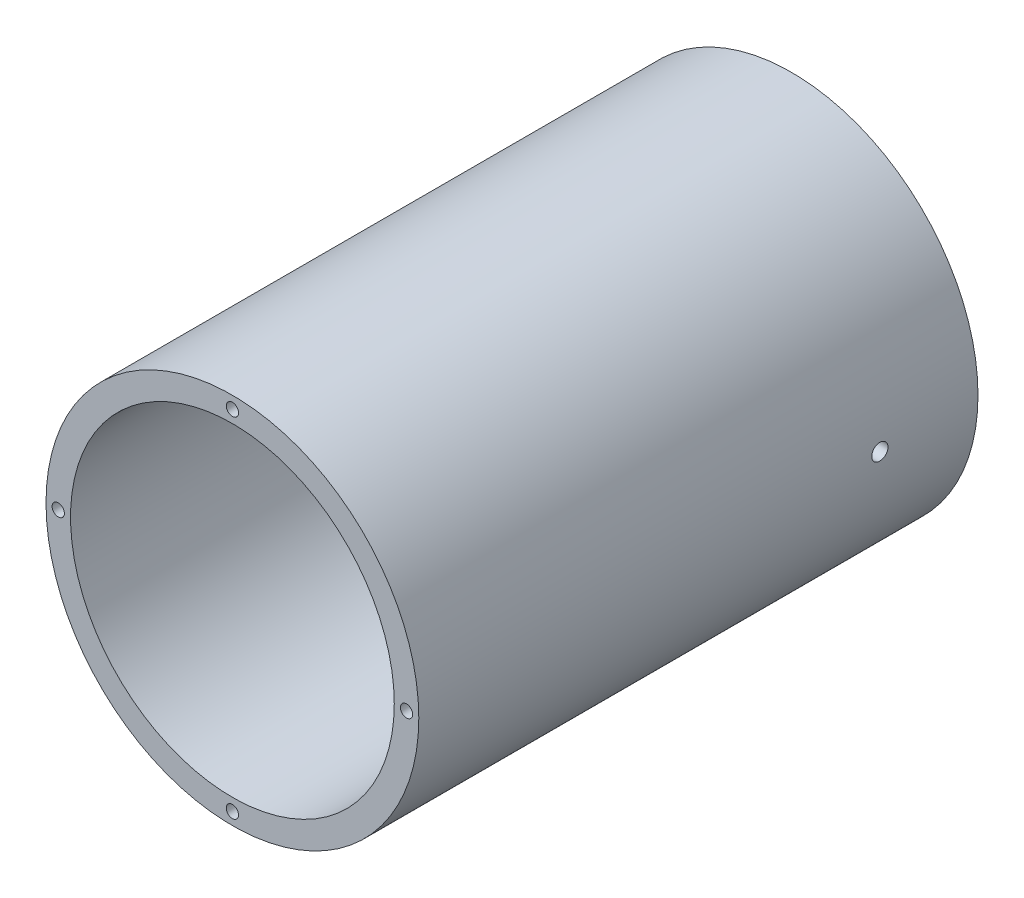
ISO-10303-21;
HEADER;
FILE_DESCRIPTION(('STEP AP214'),'2;1');
FILE_NAME('part.step','',(''),(''),'','','');
FILE_SCHEMA(('AUTOMOTIVE_DESIGN { 1 0 10303 214 1 1 1 1 }'));
ENDSEC;
DATA;
#1=APPLICATION_CONTEXT('core data for automotive mechanical design processes');
#2=APPLICATION_PROTOCOL_DEFINITION('international standard','automotive_design',2000,#1);
#3=PRODUCT_CONTEXT('',#1,'mechanical');
#4=PRODUCT('Part','Part','',(#3));
#5=PRODUCT_RELATED_PRODUCT_CATEGORY('part','',(#4));
#6=PRODUCT_DEFINITION_FORMATION('','',#4);
#7=PRODUCT_DEFINITION_CONTEXT('part definition',#1,'design');
#8=PRODUCT_DEFINITION('design','',#6,#7);
#9=PRODUCT_DEFINITION_SHAPE('','',#8);
#10=(LENGTH_UNIT() NAMED_UNIT(*) SI_UNIT(.MILLI.,.METRE.));
#11=(NAMED_UNIT(*) PLANE_ANGLE_UNIT() SI_UNIT($,.RADIAN.));
#12=(NAMED_UNIT(*) SI_UNIT($,.STERADIAN.) SOLID_ANGLE_UNIT());
#13=UNCERTAINTY_MEASURE_WITH_UNIT(LENGTH_MEASURE(1.E-05),#10,'distance_accuracy_value','');
#14=(GEOMETRIC_REPRESENTATION_CONTEXT(3) GLOBAL_UNCERTAINTY_ASSIGNED_CONTEXT((#13)) GLOBAL_UNIT_ASSIGNED_CONTEXT((#10,
#11,#12)) REPRESENTATION_CONTEXT('',''));
#15=CARTESIAN_POINT('',(0.,0.,0.));
#16=DIRECTION('',(0.,0.,1.));
#17=DIRECTION('',(1.,0.,0.));
#18=AXIS2_PLACEMENT_3D('',#15,#16,#17);
#19=CARTESIAN_POINT('',(0.,0.,57.));
#20=DIRECTION('',(0.,0.,1.));
#21=DIRECTION('',(1.,0.,0.));
#22=AXIS2_PLACEMENT_3D('',#19,#20,#21);
#23=PLANE('',#22);
#24=CARTESIAN_POINT('',(0.,35.5,57.));
#25=DIRECTION('',(0.,0.,1.));
#26=DIRECTION('',(1.,0.,0.));
#27=AXIS2_PLACEMENT_3D('',#24,#25,#26);
#28=CIRCLE('',#27,1.24999999999999);
#29=CARTESIAN_POINT('',(1.24999999999999,35.5,57.));
#30=VERTEX_POINT('',#29);
#31=EDGE_CURVE('E141',#30,#30,#28,.T.);
#32=ORIENTED_EDGE('',*,*,#31,.F.);
#33=EDGE_LOOP('',(#32));
#34=FACE_BOUND('',#33,.T.);
#35=CARTESIAN_POINT('',(35.500000000002,1.95693415158078E-12,57.));
#36=DIRECTION('',(0.,0.,1.));
#37=DIRECTION('',(1.,0.,0.));
#38=AXIS2_PLACEMENT_3D('',#35,#36,#37);
#39=CIRCLE('',#38,1.24999999999999);
#40=CARTESIAN_POINT('',(36.7500000000019,1.95693415158078E-12,57.));
#41=VERTEX_POINT('',#40);
#42=EDGE_CURVE('E149',#41,#41,#39,.T.);
#43=ORIENTED_EDGE('',*,*,#42,.F.);
#44=EDGE_LOOP('',(#43));
#45=FACE_BOUND('',#44,.T.);
#46=CARTESIAN_POINT('',(3.91386830316155E-12,-35.5,57.));
#47=DIRECTION('',(0.,0.,1.));
#48=DIRECTION('',(1.,0.,0.));
#49=AXIS2_PLACEMENT_3D('',#46,#47,#48);
#50=CIRCLE('',#49,1.24999999999999);
#51=CARTESIAN_POINT('',(1.2500000000039,-35.5,57.));
#52=VERTEX_POINT('',#51);
#53=EDGE_CURVE('E157',#52,#52,#50,.T.);
#54=ORIENTED_EDGE('',*,*,#53,.F.);
#55=EDGE_LOOP('',(#54));
#56=FACE_BOUND('',#55,.T.);
#57=CARTESIAN_POINT('',(-35.499999999998,-1.9525866554438E-12,57.));
#58=DIRECTION('',(0.,0.,1.));
#59=DIRECTION('',(1.,0.,0.));
#60=AXIS2_PLACEMENT_3D('',#57,#58,#59);
#61=CIRCLE('',#60,1.24999999999999);
#62=CARTESIAN_POINT('',(-34.2499999999981,-1.9525866554438E-12,57.));
#63=VERTEX_POINT('',#62);
#64=EDGE_CURVE('E165',#63,#63,#61,.T.);
#65=ORIENTED_EDGE('',*,*,#64,.F.);
#66=EDGE_LOOP('',(#65));
#67=FACE_BOUND('',#66,.T.);
#68=CARTESIAN_POINT('',(0.,0.,57.));
#69=DIRECTION('',(0.,0.,1.));
#70=DIRECTION('',(1.,0.,0.));
#71=AXIS2_PLACEMENT_3D('',#68,#69,#70);
#72=CIRCLE('',#71,38.);
#73=CARTESIAN_POINT('',(38.,0.,57.));
#74=VERTEX_POINT('',#73);
#75=EDGE_CURVE('E13',#74,#74,#72,.T.);
#76=ORIENTED_EDGE('',*,*,#75,.T.);
#77=EDGE_LOOP('',(#76));
#78=FACE_BOUND('',#77,.T.);
#79=CARTESIAN_POINT('',(0.,0.,57.));
#80=DIRECTION('',(0.,0.,1.));
#81=DIRECTION('',(1.,0.,0.));
#82=AXIS2_PLACEMENT_3D('',#79,#80,#81);
#83=CIRCLE('',#82,33.);
#84=CARTESIAN_POINT('',(33.,0.,57.));
#85=VERTEX_POINT('',#84);
#86=EDGE_CURVE('E174',#85,#85,#83,.T.);
#87=ORIENTED_EDGE('',*,*,#86,.F.);
#88=EDGE_LOOP('',(#87));
#89=FACE_BOUND('',#88,.T.);
#90=ADVANCED_FACE('F57',(#34,#45,#56,#67,#78,#89),#23,.T.);
#91=CARTESIAN_POINT('',(0.,0.,-57.));
#92=DIRECTION('',(0.,0.,1.));
#93=DIRECTION('',(1.,0.,0.));
#94=AXIS2_PLACEMENT_3D('',#91,#92,#93);
#95=PLANE('',#94);
#96=CARTESIAN_POINT('',(-35.5,-1.28369537222284E-13,-57.));
#97=DIRECTION('',(0.,0.,-1.));
#98=DIRECTION('',(-1.,0.,0.));
#99=AXIS2_PLACEMENT_3D('',#96,#97,#98);
#100=CIRCLE('',#99,1.24999999999999);
#101=CARTESIAN_POINT('',(-36.75,-1.28369537222284E-13,-57.));
#102=VERTEX_POINT('',#101);
#103=EDGE_CURVE('E111',#102,#102,#100,.T.);
#104=ORIENTED_EDGE('',*,*,#103,.F.);
#105=EDGE_LOOP('',(#104));
#106=FACE_BOUND('',#105,.T.);
#107=CARTESIAN_POINT('',(1.28369537222284E-13,-35.5,-57.));
#108=DIRECTION('',(0.,0.,-1.));
#109=DIRECTION('',(-1.,0.,0.));
#110=AXIS2_PLACEMENT_3D('',#107,#108,#109);
#111=CIRCLE('',#110,1.24999999999999);
#112=CARTESIAN_POINT('',(-1.24999999999986,-35.5,-57.));
#113=VERTEX_POINT('',#112);
#114=EDGE_CURVE('E110',#113,#113,#111,.T.);
#115=ORIENTED_EDGE('',*,*,#114,.F.);
#116=EDGE_LOOP('',(#115));
#117=FACE_BOUND('',#116,.T.);
#118=CARTESIAN_POINT('',(35.5,1.21430643318376E-13,-57.));
#119=DIRECTION('',(0.,0.,-1.));
#120=DIRECTION('',(-1.,0.,0.));
#121=AXIS2_PLACEMENT_3D('',#118,#119,#120);
#122=CIRCLE('',#121,1.24999999999999);
#123=CARTESIAN_POINT('',(34.25,1.21430643318376E-13,-57.));
#124=VERTEX_POINT('',#123);
#125=EDGE_CURVE('E126',#124,#124,#122,.T.);
#126=ORIENTED_EDGE('',*,*,#125,.F.);
#127=EDGE_LOOP('',(#126));
#128=FACE_BOUND('',#127,.T.);
#129=CARTESIAN_POINT('',(-1.31838984174237E-13,35.5,-57.));
#130=DIRECTION('',(0.,0.,-1.));
#131=DIRECTION('',(-1.,0.,0.));
#132=AXIS2_PLACEMENT_3D('',#129,#130,#131);
#133=CIRCLE('',#132,1.24999999999999);
#134=CARTESIAN_POINT('',(-1.25000000000012,35.5,-57.));
#135=VERTEX_POINT('',#134);
#136=EDGE_CURVE('E134',#135,#135,#133,.T.);
#137=ORIENTED_EDGE('',*,*,#136,.F.);
#138=EDGE_LOOP('',(#137));
#139=FACE_BOUND('',#138,.T.);
#140=CARTESIAN_POINT('',(0.,0.,-57.));
#141=DIRECTION('',(0.,0.,1.));
#142=DIRECTION('',(1.,0.,0.));
#143=AXIS2_PLACEMENT_3D('',#140,#141,#142);
#144=CIRCLE('',#143,38.);
#145=CARTESIAN_POINT('',(38.,0.,-57.));
#146=VERTEX_POINT('',#145);
#147=EDGE_CURVE('E62',#146,#146,#144,.T.);
#148=ORIENTED_EDGE('',*,*,#147,.F.);
#149=EDGE_LOOP('',(#148));
#150=FACE_BOUND('',#149,.T.);
#151=CARTESIAN_POINT('',(0.,0.,-57.));
#152=DIRECTION('',(0.,0.,1.));
#153=DIRECTION('',(1.,0.,0.));
#154=AXIS2_PLACEMENT_3D('',#151,#152,#153);
#155=CIRCLE('',#154,33.);
#156=CARTESIAN_POINT('',(33.,0.,-57.));
#157=VERTEX_POINT('',#156);
#158=EDGE_CURVE('E173',#157,#157,#155,.T.);
#159=ORIENTED_EDGE('',*,*,#158,.T.);
#160=EDGE_LOOP('',(#159));
#161=FACE_BOUND('',#160,.T.);
#162=ADVANCED_FACE('F184',(#106,#117,#128,#139,#150,#161),#95,.F.);
#163=CARTESIAN_POINT('',(0.,0.,57.));
#164=DIRECTION('',(0.,0.,-1.));
#165=DIRECTION('',(-1.,0.,0.));
#166=AXIS2_PLACEMENT_3D('',#163,#164,#165);
#167=CYLINDRICAL_SURFACE('',#166,38.);
#168=CARTESIAN_POINT('',(38.,0.,-38.65));
#169=CARTESIAN_POINT('',(37.9999995194342,-0.0926343873516707,-38.6499959066816));
#170=CARTESIAN_POINT('',(37.9996576411054,-0.185334831172281,-38.642172778328));
#171=CARTESIAN_POINT('',(37.9983266871406,-0.368179488595521,-38.6110751267147));
#172=CARTESIAN_POINT('',(37.9973368449294,-0.458320542349799,-38.5877823015173));
#173=CARTESIAN_POINT('',(37.9948220211121,-0.633371208626469,-38.5264124783285));
#174=CARTESIAN_POINT('',(37.9932973080715,-0.718283421510545,-38.4883428989159));
#175=CARTESIAN_POINT('',(37.9898845637712,-0.88048880307308,-38.3985113360063));
#176=CARTESIAN_POINT('',(37.9879966194285,-0.957783787787719,-38.3467526270507));
#177=CARTESIAN_POINT('',(37.9840681874147,-1.1026455365318,-38.2309655505124));
#178=CARTESIAN_POINT('',(37.9820275950093,-1.17020552646643,-38.1669287107212));
#179=CARTESIAN_POINT('',(37.9780247628371,-1.29362194407478,-38.0284195977331));
#180=CARTESIAN_POINT('',(37.9760625262425,-1.34947789832146,-37.9539469026101));
#181=CARTESIAN_POINT('',(37.9724369874736,-1.44791760866178,-37.7966468191449));
#182=CARTESIAN_POINT('',(37.9707737984872,-1.49049634385826,-37.7138162858469));
#183=CARTESIAN_POINT('',(37.9679351157005,-1.56114066866396,-37.542173978369));
#184=CARTESIAN_POINT('',(37.9667596188709,-1.58920634842029,-37.453362241345));
#185=CARTESIAN_POINT('',(37.9650297812511,-1.63001071322264,-37.2723384638531));
#186=CARTESIAN_POINT('',(37.964475045539,-1.64275914332505,-37.1801286238415));
#187=CARTESIAN_POINT('',(37.9640480975593,-1.6525971836999,-36.9948761701993));
#188=CARTESIAN_POINT('',(37.9641758809286,-1.64968689407335,-36.9018335618961));
#189=CARTESIAN_POINT('',(37.9650991939384,-1.62829825058813,-36.7176228857958));
#190=CARTESIAN_POINT('',(37.9658942721118,-1.60983042235951,-36.6264535932951));
#191=CARTESIAN_POINT('',(37.9680618446454,-1.55786723848223,-36.4485104455133));
#192=CARTESIAN_POINT('',(37.9694343409976,-1.52437183098991,-36.3617366053971));
#193=CARTESIAN_POINT('',(37.9726025679745,-1.44329225223816,-36.1950136275335));
#194=CARTESIAN_POINT('',(37.974398443021,-1.39570327199294,-36.1150668313145));
#195=CARTESIAN_POINT('',(37.9782108525346,-1.28779094357622,-35.9642929642205));
#196=CARTESIAN_POINT('',(37.9802273881547,-1.22746752886342,-35.8934659410022));
#197=CARTESIAN_POINT('',(37.9842558279272,-1.09573924181622,-35.7628808622904));
#198=CARTESIAN_POINT('',(37.9862677268738,-1.02432525129551,-35.7031320042601));
#199=CARTESIAN_POINT('',(37.9900585103676,-0.87247507991611,-35.5964701540293));
#200=CARTESIAN_POINT('',(37.9918373948659,-0.792038897167133,-35.5495571645183));
#201=CARTESIAN_POINT('',(37.9949617056859,-0.624422345518426,-35.469899672236));
#202=CARTESIAN_POINT('',(37.9963071225581,-0.537241829643565,-35.4371554783394));
#203=CARTESIAN_POINT('',(37.9984127129505,-0.358613696426568,-35.3867710218167));
#204=CARTESIAN_POINT('',(37.9991728897805,-0.267166103219724,-35.3691306737718));
#205=CARTESIAN_POINT('',(38.000021895611,-0.0826795501663628,-35.3494659641771));
#206=CARTESIAN_POINT('',(38.0001112716218,0.01035805102182,-35.347428878783));
#207=CARTESIAN_POINT('',(37.9996100533562,0.195453818730522,-35.3589953327662));
#208=CARTESIAN_POINT('',(37.9990194607665,0.287511987680262,-35.3725988333421));
#209=CARTESIAN_POINT('',(37.9972251928853,0.46800011668877,-35.4150497753351));
#210=CARTESIAN_POINT('',(37.9960217507579,0.556431442797455,-35.4438914194162));
#211=CARTESIAN_POINT('',(37.9931373199913,0.727197679025693,-35.5159940633972));
#212=CARTESIAN_POINT('',(37.9914563292868,0.80953256277903,-35.5592551256544));
#213=CARTESIAN_POINT('',(37.9878046416091,0.965827212367056,-35.6590012354753));
#214=CARTESIAN_POINT('',(37.985833757794,1.03978152191713,-35.7154948256876));
#215=CARTESIAN_POINT('',(37.9818249288001,1.17716089568691,-35.8400898419622));
#216=CARTESIAN_POINT('',(37.979786983291,1.24058590802369,-35.908191325219));
#217=CARTESIAN_POINT('',(37.9758721891793,1.35514899571533,-36.0541236369915));
#218=CARTESIAN_POINT('',(37.9739954489289,1.4062788479287,-36.1319609243227));
#219=CARTESIAN_POINT('',(37.9706163826996,1.49474403258342,-36.295122597683));
#220=CARTESIAN_POINT('',(37.9691140553915,1.53207941399412,-36.3804469571324));
#221=CARTESIAN_POINT('',(37.9666539884121,1.5918814681568,-36.5561300753228));
#222=CARTESIAN_POINT('',(37.9656960556686,1.61435341276018,-36.6464870367291));
#223=CARTESIAN_POINT('',(37.9644322501256,1.64380795207979,-36.8296957044246));
#224=CARTESIAN_POINT('',(37.9641263748285,1.65079060612304,-36.922547401157));
#225=CARTESIAN_POINT('',(37.9642012430132,1.64906774813583,-37.1080278761415));
#226=CARTESIAN_POINT('',(37.9645814200104,1.64037517939304,-37.2006567751278));
#227=CARTESIAN_POINT('',(37.9659843452615,1.60757534012015,-37.3831389278321));
#228=CARTESIAN_POINT('',(37.9670070947612,1.58346803969957,-37.4729921761677));
#229=CARTESIAN_POINT('',(37.969579765854,1.52052551056582,-37.6473756383981));
#230=CARTESIAN_POINT('',(37.9711296936865,1.48169010753575,-37.7319057892769));
#231=CARTESIAN_POINT('',(37.9745819629553,1.39039641296065,-37.8932462093979));
#232=CARTESIAN_POINT('',(37.9764842928381,1.33793856800806,-37.9700567316028));
#233=CARTESIAN_POINT('',(37.9804286955674,1.22084420114374,-38.1138412374282));
#234=CARTESIAN_POINT('',(37.9824708677174,1.15619896651988,-38.1808081225429));
#235=CARTESIAN_POINT('',(37.9864642159771,1.01656476762932,-38.3029587254949));
#236=CARTESIAN_POINT('',(37.9884153695212,0.94157325634956,-38.3581395333238));
#237=CARTESIAN_POINT('',(37.9920078745747,0.783327797499344,-38.4551710373054));
#238=CARTESIAN_POINT('',(37.993648965049,0.700066977350689,-38.4970105218983));
#239=CARTESIAN_POINT('',(37.9964322609654,0.527758473785391,-38.5660671290563));
#240=CARTESIAN_POINT('',(37.9975750575366,0.438717791979388,-38.5933015865233));
#241=CARTESIAN_POINT('',(37.9989295116819,0.290933584448799,-38.6252030188477));
#242=CARTESIAN_POINT('',(37.9993291892242,0.23314808194173,-38.6344900810134));
#243=CARTESIAN_POINT('',(37.9998645849686,0.116917158880258,-38.646889861506));
#244=CARTESIAN_POINT('',(38.0000003033378,0.058471738743788,-38.650002583743));
#245=CARTESIAN_POINT('',(38.,0.,-38.65));
#246=B_SPLINE_CURVE_WITH_KNOTS('',3,(#168,#169,#170,#171,#172,#173,#174,#175,#176,#177,#178,
#179,#180,#181,#182,#183,#184,#185,#186,#187,#188,#189,#190,#191,#192,#193,#194,#195,#196,#197,
#198,#199,#200,#201,#202,#203,#204,#205,#206,#207,#208,#209,#210,#211,#212,#213,#214,#215,#216,
#217,#218,#219,#220,#221,#222,#223,#224,#225,#226,#227,#228,#229,#230,#231,#232,#233,#234,#235,
#236,#237,#238,#239,#240,#241,#242,#243,#244,#245),.UNSPECIFIED.,.T.,.F.,(4,2,2,2,2,2,2,2,2,2,2,
2,2,2,2,2,2,2,2,2,2,2,2,2,2,2,2,2,2,2,2,2,2,2,2,2,2,2,4),(0.,0.277689723908341,0.55570856448434,
0.833588007566176,1.11140103984864,1.38940646428512,1.66742313184257,1.94554480670585,
2.22366475400959,2.50160766351495,2.77954879622557,3.05730203557773,3.33505623315867,
3.61290531498349,3.89075584869049,4.16883604025131,4.44691629007441,4.72500260163852,
5.00308734049132,5.28094528805699,5.55880254630918,5.83655417009631,6.11430699504812,
6.39223962815774,6.67017363073479,6.94829300489981,7.22641139175251,7.50443108096261,
7.78244970530096,8.06023887022386,8.3380285738055,8.61582156531613,8.89360545092686,
9.1715886812928,9.44964046718964,9.7279253055539,10.0058791087496,10.1811597117191,
10.3564402036877),.UNSPECIFIED.);
#247=CARTESIAN_POINT('',(38.,0.,-38.65));
#248=VERTEX_POINT('',#247);
#249=EDGE_CURVE('E291',#248,#248,#246,.T.);
#250=ORIENTED_EDGE('',*,*,#249,.T.);
#251=EDGE_LOOP('',(#250));
#252=FACE_BOUND('',#251,.T.);
#253=CARTESIAN_POINT('',(-38.,0.,-35.35));
#254=CARTESIAN_POINT('',(-37.9999995194343,-0.0926343873516703,-35.3500040933184));
#255=CARTESIAN_POINT('',(-37.9996576411054,-0.18533483117228,-35.357827221672));
#256=CARTESIAN_POINT('',(-37.9983266871406,-0.368179488595519,-35.3889248732853));
#257=CARTESIAN_POINT('',(-37.9973368449294,-0.458320542349798,-35.4122176984827));
#258=CARTESIAN_POINT('',(-37.9948220211121,-0.633371208626468,-35.4735875216715));
#259=CARTESIAN_POINT('',(-37.9932973080715,-0.718283421510543,-35.5116571010841));
#260=CARTESIAN_POINT('',(-37.9898845637712,-0.880488803073077,-35.6014886639937));
#261=CARTESIAN_POINT('',(-37.9879966194285,-0.957783787787716,-35.6532473729493));
#262=CARTESIAN_POINT('',(-37.9840681874147,-1.10264553653179,-35.7690344494876));
#263=CARTESIAN_POINT('',(-37.9820275950093,-1.17020552646643,-35.8330712892788));
#264=CARTESIAN_POINT('',(-37.9780247628371,-1.29362194407478,-35.9715804022669));
#265=CARTESIAN_POINT('',(-37.9760625262425,-1.34947789832146,-36.0460530973899));
#266=CARTESIAN_POINT('',(-37.9724369874736,-1.44791760866178,-36.2033531808551));
#267=CARTESIAN_POINT('',(-37.9707737984872,-1.49049634385826,-36.2861837141531));
#268=CARTESIAN_POINT('',(-37.9679351157005,-1.56114066866396,-36.457826021631));
#269=CARTESIAN_POINT('',(-37.9667596188709,-1.58920634842029,-36.546637758655));
#270=CARTESIAN_POINT('',(-37.9650297812511,-1.63001071322264,-36.7276615361469));
#271=CARTESIAN_POINT('',(-37.964475045539,-1.64275914332505,-36.8198713761585));
#272=CARTESIAN_POINT('',(-37.9640480975593,-1.65259718369991,-37.0051238298007));
#273=CARTESIAN_POINT('',(-37.9641758809286,-1.64968689407335,-37.0981664381039));
#274=CARTESIAN_POINT('',(-37.9650991939384,-1.62829825058814,-37.2823771142042));
#275=CARTESIAN_POINT('',(-37.9658942721118,-1.60983042235951,-37.3735464067049));
#276=CARTESIAN_POINT('',(-37.9680618446454,-1.55786723848224,-37.5514895544868));
#277=CARTESIAN_POINT('',(-37.9694343409976,-1.52437183098992,-37.6382633946029));
#278=CARTESIAN_POINT('',(-37.9726025679745,-1.44329225223817,-37.8049863724665));
#279=CARTESIAN_POINT('',(-37.974398443021,-1.39570327199295,-37.8849331686855));
#280=CARTESIAN_POINT('',(-37.9782108525346,-1.28779094357623,-38.0357070357795));
#281=CARTESIAN_POINT('',(-37.9802273881547,-1.22746752886342,-38.1065340589978));
#282=CARTESIAN_POINT('',(-37.9842558279272,-1.09573924181623,-38.2371191377096));
#283=CARTESIAN_POINT('',(-37.9862677268738,-1.02432525129551,-38.2968679957399));
#284=CARTESIAN_POINT('',(-37.9900585103676,-0.872475079916115,-38.4035298459707));
#285=CARTESIAN_POINT('',(-37.9918373948659,-0.792038897167139,-38.4504428354817));
#286=CARTESIAN_POINT('',(-37.9949617056859,-0.624422345518431,-38.530100327764));
#287=CARTESIAN_POINT('',(-37.9963071225581,-0.537241829643569,-38.5628445216606));
#288=CARTESIAN_POINT('',(-37.9984127129505,-0.358613696426572,-38.6132289781833));
#289=CARTESIAN_POINT('',(-37.9991728897805,-0.26716610321973,-38.6308693262282));
#290=CARTESIAN_POINT('',(-38.000021895611,-0.0826795501663708,-38.6505340358229));
#291=CARTESIAN_POINT('',(-38.0001112716218,0.0103580510218117,-38.652571121217));
#292=CARTESIAN_POINT('',(-37.9996100533562,0.195453818730513,-38.6410046672338));
#293=CARTESIAN_POINT('',(-37.9990194607665,0.287511987680253,-38.6274011666579));
#294=CARTESIAN_POINT('',(-37.9972251928853,0.468000116688761,-38.584950224665));
#295=CARTESIAN_POINT('',(-37.9960217507579,0.556431442797446,-38.5561085805838));
#296=CARTESIAN_POINT('',(-37.9931373199913,0.727197679025684,-38.4840059366028));
#297=CARTESIAN_POINT('',(-37.9914563292868,0.809532562779022,-38.4407448743456));
#298=CARTESIAN_POINT('',(-37.9878046416091,0.96582721236705,-38.3409987645247));
#299=CARTESIAN_POINT('',(-37.985833757794,1.03978152191712,-38.2845051743125));
#300=CARTESIAN_POINT('',(-37.9818249288001,1.1771608956869,-38.1599101580378));
#301=CARTESIAN_POINT('',(-37.979786983291,1.24058590802369,-38.0918086747811));
#302=CARTESIAN_POINT('',(-37.9758721891793,1.35514899571533,-37.9458763630085));
#303=CARTESIAN_POINT('',(-37.9739954489289,1.40627884792869,-37.8680390756773));
#304=CARTESIAN_POINT('',(-37.9706163826996,1.49474403258342,-37.704877402317));
#305=CARTESIAN_POINT('',(-37.9691140553915,1.53207941399411,-37.6195530428676));
#306=CARTESIAN_POINT('',(-37.9666539884121,1.5918814681568,-37.4438699246772));
#307=CARTESIAN_POINT('',(-37.9656960556686,1.61435341276017,-37.3535129632709));
#308=CARTESIAN_POINT('',(-37.9644322501256,1.64380795207978,-37.1703042955755));
#309=CARTESIAN_POINT('',(-37.9641263748285,1.65079060612303,-37.077452598843));
#310=CARTESIAN_POINT('',(-37.9642012430132,1.64906774813583,-36.8919721238585));
#311=CARTESIAN_POINT('',(-37.9645814200104,1.64037517939304,-36.7993432248723));
#312=CARTESIAN_POINT('',(-37.9659843452615,1.60757534012015,-36.6168610721679));
#313=CARTESIAN_POINT('',(-37.9670070947612,1.58346803969956,-36.5270078238323));
#314=CARTESIAN_POINT('',(-37.969579765854,1.52052551056582,-36.3526243616019));
#315=CARTESIAN_POINT('',(-37.9711296936865,1.48169010753574,-36.2680942107232));
#316=CARTESIAN_POINT('',(-37.9745819629553,1.39039641296064,-36.1067537906021));
#317=CARTESIAN_POINT('',(-37.9764842928381,1.33793856800806,-36.0299432683972));
#318=CARTESIAN_POINT('',(-37.9804286955674,1.22084420114374,-35.8861587625718));
#319=CARTESIAN_POINT('',(-37.9824708677174,1.15619896651987,-35.8191918774571));
#320=CARTESIAN_POINT('',(-37.9864642159771,1.01656476762932,-35.6970412745051));
#321=CARTESIAN_POINT('',(-37.9884153695212,0.941573256349557,-35.6418604666762));
#322=CARTESIAN_POINT('',(-37.9920078745747,0.783327797499343,-35.5448289626946));
#323=CARTESIAN_POINT('',(-37.993648965049,0.70006697735069,-35.5029894781017));
#324=CARTESIAN_POINT('',(-37.9964322609654,0.527758473785392,-35.4339328709437));
#325=CARTESIAN_POINT('',(-37.9975750575366,0.438717791979388,-35.4066984134767));
#326=CARTESIAN_POINT('',(-37.9989295116819,0.290933584448799,-35.3747969811523));
#327=CARTESIAN_POINT('',(-37.9993291892242,0.233148081941729,-35.3655099189866));
#328=CARTESIAN_POINT('',(-37.9998645849686,0.116917158880257,-35.353110138494));
#329=CARTESIAN_POINT('',(-38.0000003033378,0.0584717387437876,-35.3499974162571));
#330=CARTESIAN_POINT('',(-38.,0.,-35.35));
#331=B_SPLINE_CURVE_WITH_KNOTS('',3,(#253,#254,#255,#256,#257,#258,#259,#260,#261,#262,#263,
#264,#265,#266,#267,#268,#269,#270,#271,#272,#273,#274,#275,#276,#277,#278,#279,#280,#281,#282,
#283,#284,#285,#286,#287,#288,#289,#290,#291,#292,#293,#294,#295,#296,#297,#298,#299,#300,#301,
#302,#303,#304,#305,#306,#307,#308,#309,#310,#311,#312,#313,#314,#315,#316,#317,#318,#319,#320,
#321,#322,#323,#324,#325,#326,#327,#328,#329,#330),.UNSPECIFIED.,.T.,.F.,(4,2,2,2,2,2,2,2,2,2,2,
2,2,2,2,2,2,2,2,2,2,2,2,2,2,2,2,2,2,2,2,2,2,2,2,2,2,2,4),(0.,0.27768972390834,0.555708564484338,
0.833588007566171,1.11140103984864,1.38940646428512,1.66742313184256,1.94554480670585,
2.22366475400959,2.50160766351495,2.77954879622557,3.05730203557773,3.33505623315867,
3.61290531498349,3.89075584869049,4.16883604025131,4.44691629007441,4.72500260163852,
5.00308734049131,5.28094528805699,5.55880254630918,5.83655417009631,6.11430699504812,
6.39223962815775,6.6701736307348,6.94829300489981,7.2264113917525,7.50443108096261,
7.78244970530096,8.06023887022386,8.3380285738055,8.61582156531614,8.89360545092686,
9.17158868129281,9.44964046718964,9.7279253055539,10.0058791087496,10.1811597117191,
10.3564402036877),.UNSPECIFIED.);
#332=CARTESIAN_POINT('',(-38.,0.,-35.35));
#333=VERTEX_POINT('',#332);
#334=EDGE_CURVE('E120',#333,#333,#331,.T.);
#335=ORIENTED_EDGE('',*,*,#334,.T.);
#336=EDGE_LOOP('',(#335));
#337=FACE_BOUND('',#336,.T.);
#338=ORIENTED_EDGE('',*,*,#75,.F.);
#339=EDGE_LOOP('',(#338));
#340=FACE_BOUND('',#339,.T.);
#341=ORIENTED_EDGE('',*,*,#147,.T.);
#342=EDGE_LOOP('',(#341));
#343=FACE_BOUND('',#342,.T.);
#344=ADVANCED_FACE('F59',(#252,#337,#340,#343),#167,.T.);
#345=CARTESIAN_POINT('',(0.,0.,57.));
#346=DIRECTION('',(0.,0.,-1.));
#347=DIRECTION('',(-1.,0.,0.));
#348=AXIS2_PLACEMENT_3D('',#345,#346,#347);
#349=CYLINDRICAL_SURFACE('',#348,33.);
#350=CARTESIAN_POINT('',(33.,0.,-38.65));
#351=CARTESIAN_POINT('',(32.9999994481235,-0.0926191339515854,-38.6499959124436));
#352=CARTESIAN_POINT('',(32.9996059010118,-0.185303950535008,-38.6421753499103));
#353=CARTESIAN_POINT('',(32.9980737975902,-0.3681167382503,-38.6110884842682));
#354=CARTESIAN_POINT('',(32.9969343635108,-0.458241566209627,-38.5878039825247));
#355=CARTESIAN_POINT('',(32.9940394509726,-0.633259701322019,-38.5264575654243));
#356=CARTESIAN_POINT('',(32.9922842865124,-0.718155649108804,-38.4884031810844));
#357=CARTESIAN_POINT('',(32.9883555871818,-0.880331715106604,-38.3986087943358));
#358=CARTESIAN_POINT('',(32.9861821511057,-0.957613625223092,-38.3468720225827));
#359=CARTESIAN_POINT('',(32.9816589523635,-1.10246893824028,-38.2311232911381));
#360=CARTESIAN_POINT('',(32.9793090355716,-1.17003370119338,-38.1671005240325));
#361=CARTESIAN_POINT('',(32.9746990543606,-1.29346318015329,-38.0286187466446));
#362=CARTESIAN_POINT('',(32.9724389936151,-1.34932741821444,-37.9541593102501));
#363=CARTESIAN_POINT('',(32.9682624921126,-1.44779388417606,-37.7968725060756));
#364=CARTESIAN_POINT('',(32.9663462263675,-1.49038936557224,-37.7140409097232));
#365=CARTESIAN_POINT('',(32.9630752843664,-1.56106590526938,-37.5423908353607));
#366=CARTESIAN_POINT('',(32.9617206038488,-1.58914707371534,-37.4535724027889));
#367=CARTESIAN_POINT('',(32.9597269894798,-1.62997504151138,-37.2725493593225));
#368=CARTESIAN_POINT('',(32.9590874523122,-1.6427347671606,-37.1803476705782));
#369=CARTESIAN_POINT('',(32.9585944325064,-1.65259752960761,-36.9951090302844));
#370=CARTESIAN_POINT('',(32.9587409436652,-1.64970068996057,-36.9020720853321));
#371=CARTESIAN_POINT('',(32.9598029379067,-1.62834332102025,-36.7178917732163));
#372=CARTESIAN_POINT('',(32.9607177309142,-1.60989675852379,-36.6267467819464));
#373=CARTESIAN_POINT('',(32.9632120957861,-1.55798521788351,-36.448848661837));
#374=CARTESIAN_POINT('',(32.9647916704595,-1.52452017627749,-36.3620955515577));
#375=CARTESIAN_POINT('',(32.9684383621007,-1.44350567711266,-36.195398803597));
#376=CARTESIAN_POINT('',(32.9705056994,-1.39594985198881,-36.1154582655626));
#377=CARTESIAN_POINT('',(32.9748946824163,-1.28810836089485,-35.9646897844545));
#378=CARTESIAN_POINT('',(32.977216329928,-1.22782260508703,-35.8938619056962));
#379=CARTESIAN_POINT('',(32.9818553281202,-1.09615372672469,-35.7632479945926));
#380=CARTESIAN_POINT('',(32.9841726712985,-1.02475850925646,-35.7034741539041));
#381=CARTESIAN_POINT('',(32.9885394215882,-0.872939863318933,-35.59675902529));
#382=CARTESIAN_POINT('',(32.9905888286336,-0.792516432628928,-35.5498177405209));
#383=CARTESIAN_POINT('',(32.9941888251703,-0.624917155791918,-35.4701013843318));
#384=CARTESIAN_POINT('',(32.9957393996818,-0.537741106961312,-35.437326738326));
#385=CARTESIAN_POINT('',(32.9981667603576,-0.359114366901192,-35.3868819809056));
#386=CARTESIAN_POINT('',(32.9990435515661,-0.267663707677941,-35.3692117564154));
#387=CARTESIAN_POINT('',(33.000023881358,-0.0831895361895966,-35.3494924612399));
#388=CARTESIAN_POINT('',(33.0001282546746,0.00983216925024847,-35.3474265273286));
#389=CARTESIAN_POINT('',(32.9995542018301,0.194900926715854,-35.3589304502089));
#390=CARTESIAN_POINT('',(32.998875778258,0.286947981964072,-35.3725002552882));
#391=CARTESIAN_POINT('',(32.9968130816713,0.467407306100833,-35.4148765017133));
#392=CARTESIAN_POINT('',(32.995429165365,0.555821387489725,-35.4436752433423));
#393=CARTESIAN_POINT('',(32.9921112935293,0.726560844072022,-35.5156840655901));
#394=CARTESIAN_POINT('',(32.9901773348337,0.808886184213641,-35.558894229165));
#395=CARTESIAN_POINT('',(32.9859748599013,0.965188672629343,-35.6585424905797));
#396=CARTESIAN_POINT('',(32.9837060583846,1.03915860643786,-35.7149918924059));
#397=CARTESIAN_POINT('',(32.9790903594782,1.1765780072776,-35.8394997230978));
#398=CARTESIAN_POINT('',(32.9767434615876,1.24002740681006,-35.9075582264407));
#399=CARTESIAN_POINT('',(32.9722337097007,1.35466141487625,-36.0534248719194));
#400=CARTESIAN_POINT('',(32.9700710205226,1.40583511272875,-36.1312415943507));
#401=CARTESIAN_POINT('',(32.9661761530703,1.49439051173933,-36.2943723897117));
#402=CARTESIAN_POINT('',(32.9644439729226,1.53177227292116,-36.3796864300104));
#403=CARTESIAN_POINT('',(32.9616066297395,1.59166364436849,-36.55534968679));
#404=CARTESIAN_POINT('',(32.9605011734868,1.6141802102362,-36.6456965268735));
#405=CARTESIAN_POINT('',(32.9590411117993,1.64372477798194,-36.8288940254143));
#406=CARTESIAN_POINT('',(32.9586865021016,1.6507528677948,-36.9217446696533));
#407=CARTESIAN_POINT('',(32.9587682280492,1.64912014479058,-37.1072054760096));
#408=CARTESIAN_POINT('',(32.9592036983574,1.64047649648887,-37.1998157901093));
#409=CARTESIAN_POINT('',(32.9608146749974,1.60778113925587,-37.3822686812748));
#410=CARTESIAN_POINT('',(32.9619901827397,1.5837294009592,-37.4721112530652));
#411=CARTESIAN_POINT('',(32.9649485507496,1.52090410891892,-37.646481956884));
#412=CARTESIAN_POINT('',(32.9667314154745,1.4821304471342,-37.7310100499052));
#413=CARTESIAN_POINT('',(32.9707034986418,1.39096491528371,-37.8923577576059));
#414=CARTESIAN_POINT('',(32.9728927046155,1.33857346305855,-37.9691776087005));
#415=CARTESIAN_POINT('',(32.9774334626002,1.22159809802664,-38.1130139259491));
#416=CARTESIAN_POINT('',(32.9797851724696,1.15700222100154,-38.1800206567271));
#417=CARTESIAN_POINT('',(32.9843847702225,1.01745949783207,-38.3022597934191));
#418=CARTESIAN_POINT('',(32.9866326324224,0.942510109142604,-38.3574892986617));
#419=CARTESIAN_POINT('',(32.9907727913162,0.784329069660855,-38.4546320475137));
#420=CARTESIAN_POINT('',(32.9926647452559,0.701089551902515,-38.496532481239));
#421=CARTESIAN_POINT('',(32.9958747696858,0.528809939688483,-38.5657129815935));
#422=CARTESIAN_POINT('',(32.9971935176732,0.439776836877363,-38.5930103171208));
#423=CARTESIAN_POINT('',(32.9987597283397,0.291825477930083,-38.6250496050241));
#424=CARTESIAN_POINT('',(32.9992227861963,0.233865526633998,-38.6343940578482));
#425=CARTESIAN_POINT('',(32.9998430966389,0.117279163384318,-38.6468705469455));
#426=CARTESIAN_POINT('',(33.0000003494858,0.0586527519994347,-38.6500025885195));
#427=CARTESIAN_POINT('',(33.,0.,-38.65));
#428=B_SPLINE_CURVE_WITH_KNOTS('',3,(#350,#351,#352,#353,#354,#355,#356,#357,#358,#359,#360,
#361,#362,#363,#364,#365,#366,#367,#368,#369,#370,#371,#372,#373,#374,#375,#376,#377,#378,#379,
#380,#381,#382,#383,#384,#385,#386,#387,#388,#389,#390,#391,#392,#393,#394,#395,#396,#397,#398,
#399,#400,#401,#402,#403,#404,#405,#406,#407,#408,#409,#410,#411,#412,#413,#414,#415,#416,#417,
#418,#419,#420,#421,#422,#423,#424,#425,#426,#427),.UNSPECIFIED.,.T.,.F.,(4,2,2,2,2,2,2,2,2,2,2,
2,2,2,2,2,2,2,2,2,2,2,2,2,2,2,2,2,2,2,2,2,2,2,2,2,2,2,4),(0.,0.277643297422005,0.55561391789065,
0.833442989699429,1.11120651958985,1.38921551442524,1.66723586322018,1.94539734170032,
2.22355670926086,2.50148123580566,2.77940356908755,3.05707653755261,3.33475067936556,
3.61255049281217,3.89035226681436,4.16845862850612,4.44656505860523,4.72467983946105,
5.00279253825822,5.2806046434971,5.55841582992693,5.83608668974145,6.11375914793269,
6.39166955838211,6.66958175180998,6.94774004675735,7.22589713112058,7.50392397004534,
7.78194923048649,8.05967016690339,8.33739163261412,8.61511513650376,8.89283011988726,
9.17081877832874,9.44887582509923,9.72719929646598,10.0051929046735,10.1810157251676,
10.3568383956375),.UNSPECIFIED.);
#429=CARTESIAN_POINT('',(33.,0.,-38.65));
#430=VERTEX_POINT('',#429);
#431=EDGE_CURVE('E318',#430,#430,#428,.T.);
#432=ORIENTED_EDGE('',*,*,#431,.F.);
#433=EDGE_LOOP('',(#432));
#434=FACE_BOUND('',#433,.T.);
#435=CARTESIAN_POINT('',(-33.,0.,-35.35));
#436=CARTESIAN_POINT('',(-32.9999994481235,-0.0926191339516156,-35.3500040875564));
#437=CARTESIAN_POINT('',(-32.9996059010118,-0.185303950535038,-35.3578246500897));
#438=CARTESIAN_POINT('',(-32.9980737975902,-0.368116738250329,-35.3889115157318));
#439=CARTESIAN_POINT('',(-32.9969343635108,-0.458241566209656,-35.4121960174753));
#440=CARTESIAN_POINT('',(-32.9940394509726,-0.633259701322047,-35.4735424345757));
#441=CARTESIAN_POINT('',(-32.9922842865124,-0.718155649108831,-35.5115968189156));
#442=CARTESIAN_POINT('',(-32.9883555871818,-0.880331715106629,-35.6013912056643));
#443=CARTESIAN_POINT('',(-32.9861821511057,-0.957613625223116,-35.6531279774174));
#444=CARTESIAN_POINT('',(-32.9816589523635,-1.1024689382403,-35.768876708862));
#445=CARTESIAN_POINT('',(-32.9793090355716,-1.17003370119341,-35.8328994759675));
#446=CARTESIAN_POINT('',(-32.9746990543606,-1.29346318015331,-35.9713812533555));
#447=CARTESIAN_POINT('',(-32.9724389936151,-1.34932741821445,-36.04584068975));
#448=CARTESIAN_POINT('',(-32.9682624921126,-1.44779388417607,-36.2031274939244));
#449=CARTESIAN_POINT('',(-32.9663462263675,-1.49038936557225,-36.2859590902769));
#450=CARTESIAN_POINT('',(-32.9630752843664,-1.56106590526939,-36.4576091646393));
#451=CARTESIAN_POINT('',(-32.9617206038488,-1.58914707371535,-36.5464275972112));
#452=CARTESIAN_POINT('',(-32.9597269894798,-1.62997504151138,-36.7274506406776));
#453=CARTESIAN_POINT('',(-32.9590874523122,-1.64273476716061,-36.8196523294218));
#454=CARTESIAN_POINT('',(-32.9585944325064,-1.65259752960761,-37.0048909697156));
#455=CARTESIAN_POINT('',(-32.9587409436652,-1.64970068996057,-37.0979279146679));
#456=CARTESIAN_POINT('',(-32.9598029379067,-1.62834332102025,-37.2821082267837));
#457=CARTESIAN_POINT('',(-32.9607177309142,-1.60989675852379,-37.3732532180537));
#458=CARTESIAN_POINT('',(-32.9632120957861,-1.55798521788351,-37.551151338163));
#459=CARTESIAN_POINT('',(-32.9647916704595,-1.52452017627749,-37.6379044484424));
#460=CARTESIAN_POINT('',(-32.9684383621007,-1.44350567711265,-37.8046011964031));
#461=CARTESIAN_POINT('',(-32.9705056994,-1.3959498519888,-37.8845417344374));
#462=CARTESIAN_POINT('',(-32.9748946824163,-1.28810836089483,-38.0353102155456));
#463=CARTESIAN_POINT('',(-32.977216329928,-1.22782260508701,-38.1061380943038));
#464=CARTESIAN_POINT('',(-32.9818553281202,-1.09615372672467,-38.2367520054075));
#465=CARTESIAN_POINT('',(-32.9841726712985,-1.02475850925643,-38.2965258460959));
#466=CARTESIAN_POINT('',(-32.9885394215882,-0.872939863318906,-38.40324097471));
#467=CARTESIAN_POINT('',(-32.9905888286336,-0.792516432628902,-38.4501822594792));
#468=CARTESIAN_POINT('',(-32.9941888251703,-0.624917155791892,-38.5298986156682));
#469=CARTESIAN_POINT('',(-32.9957393996818,-0.537741106961285,-38.562673261674));
#470=CARTESIAN_POINT('',(-32.9981667603576,-0.359114366901164,-38.6131180190944));
#471=CARTESIAN_POINT('',(-32.9990435515661,-0.267663707677914,-38.6307882435847));
#472=CARTESIAN_POINT('',(-33.000023881358,-0.0831895361895703,-38.6505075387602));
#473=CARTESIAN_POINT('',(-33.0001282546746,0.0098321692502747,-38.6525734726715));
#474=CARTESIAN_POINT('',(-32.9995542018301,0.194900926715879,-38.6410695497911));
#475=CARTESIAN_POINT('',(-32.998875778258,0.286947981964095,-38.6274997447118));
#476=CARTESIAN_POINT('',(-32.9968130816713,0.467407306100856,-38.5851234982867));
#477=CARTESIAN_POINT('',(-32.995429165365,0.555821387489747,-38.5563247566577));
#478=CARTESIAN_POINT('',(-32.9921112935293,0.726560844072042,-38.4843159344099));
#479=CARTESIAN_POINT('',(-32.9901773348337,0.80888618421366,-38.441105770835));
#480=CARTESIAN_POINT('',(-32.9859748599013,0.96518867262936,-38.3414575094203));
#481=CARTESIAN_POINT('',(-32.9837060583846,1.03915860643788,-38.2850081075941));
#482=CARTESIAN_POINT('',(-32.9790903594782,1.17657800727762,-38.1605002769022));
#483=CARTESIAN_POINT('',(-32.9767434615876,1.24002740681007,-38.0924417735592));
#484=CARTESIAN_POINT('',(-32.9722337097007,1.35466141487626,-37.9465751280806));
#485=CARTESIAN_POINT('',(-32.9700710205226,1.40583511272876,-37.8687584056493));
#486=CARTESIAN_POINT('',(-32.9661761530703,1.49439051173934,-37.7056276102883));
#487=CARTESIAN_POINT('',(-32.9644439729226,1.53177227292117,-37.6203135699896));
#488=CARTESIAN_POINT('',(-32.9616066297395,1.5916636443685,-37.44465031321));
#489=CARTESIAN_POINT('',(-32.9605011734868,1.6141802102362,-37.3543034731265));
#490=CARTESIAN_POINT('',(-32.9590411117993,1.64372477798194,-37.1711059745857));
#491=CARTESIAN_POINT('',(-32.9586865021016,1.6507528677948,-37.0782553303466));
#492=CARTESIAN_POINT('',(-32.9587682280492,1.64912014479058,-36.8927945239904));
#493=CARTESIAN_POINT('',(-32.9592036983574,1.64047649648886,-36.8001842098906));
#494=CARTESIAN_POINT('',(-32.9608146749974,1.60778113925586,-36.6177313187252));
#495=CARTESIAN_POINT('',(-32.9619901827397,1.58372940095918,-36.5278887469347));
#496=CARTESIAN_POINT('',(-32.9649485507496,1.5209041089189,-36.353518043116));
#497=CARTESIAN_POINT('',(-32.9667314154745,1.48213044713419,-36.2689899500948));
#498=CARTESIAN_POINT('',(-32.9707034986418,1.39096491528369,-36.1076422423941));
#499=CARTESIAN_POINT('',(-32.9728927046155,1.33857346305853,-36.0308223912995));
#500=CARTESIAN_POINT('',(-32.9774334626002,1.22159809802662,-35.8869860740509));
#501=CARTESIAN_POINT('',(-32.9797851724696,1.15700222100151,-35.8199793432729));
#502=CARTESIAN_POINT('',(-32.9843847702225,1.01745949783204,-35.6977402065809));
#503=CARTESIAN_POINT('',(-32.9866326324224,0.94251010914258,-35.6425107013383));
#504=CARTESIAN_POINT('',(-32.9907727913162,0.784329069660831,-35.5453679524863));
#505=CARTESIAN_POINT('',(-32.9926647452559,0.70108955190249,-35.503467518761));
#506=CARTESIAN_POINT('',(-32.9958747696858,0.528809939688457,-35.4342870184065));
#507=CARTESIAN_POINT('',(-32.9971935176732,0.439776836877337,-35.4069896828793));
#508=CARTESIAN_POINT('',(-32.9987597283397,0.291825477930056,-35.3749503949759));
#509=CARTESIAN_POINT('',(-32.9992227861963,0.23386552663397,-35.3656059421518));
#510=CARTESIAN_POINT('',(-32.9998430966389,0.117279163384288,-35.3531294530545));
#511=CARTESIAN_POINT('',(-33.0000003494858,0.0586527519994047,-35.3499974114805));
#512=CARTESIAN_POINT('',(-33.,0.,-35.35));
#513=B_SPLINE_CURVE_WITH_KNOTS('',3,(#435,#436,#437,#438,#439,#440,#441,#442,#443,#444,#445,
#446,#447,#448,#449,#450,#451,#452,#453,#454,#455,#456,#457,#458,#459,#460,#461,#462,#463,#464,
#465,#466,#467,#468,#469,#470,#471,#472,#473,#474,#475,#476,#477,#478,#479,#480,#481,#482,#483,
#484,#485,#486,#487,#488,#489,#490,#491,#492,#493,#494,#495,#496,#497,#498,#499,#500,#501,#502,
#503,#504,#505,#506,#507,#508,#509,#510,#511,#512),.UNSPECIFIED.,.T.,.F.,(4,2,2,2,2,2,2,2,2,2,2,
2,2,2,2,2,2,2,2,2,2,2,2,2,2,2,2,2,2,2,2,2,2,2,2,2,2,2,4),(0.,0.277643297422005,
0.555613917890649,0.833442989699429,1.11120651958986,1.38921551442525,1.66723586322018,
1.94539734170031,2.22355670926085,2.50148123580565,2.77940356908753,3.0570765375526,
3.33475067936555,3.61255049281217,3.89035226681436,4.16845862850613,4.44656505860523,
4.72467983946105,5.00279253825822,5.2806046434971,5.55841582992693,5.83608668974144,
6.11375914793269,6.39166955838211,6.66958175180998,6.94774004675736,7.22589713112059,
7.50392397004534,7.78194923048649,8.05967016690339,8.33739163261412,8.61511513650377,
8.89283011988726,9.17081877832873,9.44887582509923,9.72719929646597,10.0051929046735,
10.1810157251676,10.3568383956375),.UNSPECIFIED.);
#514=CARTESIAN_POINT('',(-33.,0.,-35.35));
#515=VERTEX_POINT('',#514);
#516=EDGE_CURVE('E286',#515,#515,#513,.T.);
#517=ORIENTED_EDGE('',*,*,#516,.F.);
#518=EDGE_LOOP('',(#517));
#519=FACE_BOUND('',#518,.T.);
#520=ORIENTED_EDGE('',*,*,#86,.T.);
#521=EDGE_LOOP('',(#520));
#522=FACE_BOUND('',#521,.T.);
#523=ORIENTED_EDGE('',*,*,#158,.F.);
#524=EDGE_LOOP('',(#523));
#525=FACE_BOUND('',#524,.T.);
#526=ADVANCED_FACE('F186',(#434,#519,#522,#525),#349,.F.);
#527=CARTESIAN_POINT('',(-35.499999999998,-1.9525866554438E-12,48.5));
#528=DIRECTION('',(0.,0.,1.));
#529=DIRECTION('',(1.,0.,0.));
#530=AXIS2_PLACEMENT_3D('',#527,#528,#529);
#531=CONICAL_SURFACE('',#530,1.24999999999999,1.02974425867665);
#532=CARTESIAN_POINT('',(-35.499999999998,-1.9525866554438E-12,47.7489242262155));
#533=VERTEX_POINT('',#532);
#534=VERTEX_LOOP('',#533);
#535=FACE_BOUND('',#534,.T.);
#536=CARTESIAN_POINT('',(-35.499999999998,-1.9525866554438E-12,48.5));
#537=DIRECTION('',(0.,0.,1.));
#538=DIRECTION('',(1.,0.,0.));
#539=AXIS2_PLACEMENT_3D('',#536,#537,#538);
#540=CIRCLE('',#539,1.24999999999999);
#541=CARTESIAN_POINT('',(-34.2499999999981,-1.9525866554438E-12,48.5));
#542=VERTEX_POINT('',#541);
#543=EDGE_CURVE('E169',#542,#542,#540,.T.);
#544=ORIENTED_EDGE('',*,*,#543,.T.);
#545=EDGE_LOOP('',(#544));
#546=FACE_BOUND('',#545,.T.);
#547=ADVANCED_FACE('F188',(#535,#546),#531,.F.);
#548=CARTESIAN_POINT('',(-35.499999999998,-1.9525866554438E-12,57.));
#549=DIRECTION('',(0.,0.,1.));
#550=DIRECTION('',(1.,0.,0.));
#551=AXIS2_PLACEMENT_3D('',#548,#549,#550);
#552=CYLINDRICAL_SURFACE('',#551,1.24999999999999);
#553=ORIENTED_EDGE('',*,*,#543,.F.);
#554=EDGE_LOOP('',(#553));
#555=FACE_BOUND('',#554,.T.);
#556=ORIENTED_EDGE('',*,*,#64,.T.);
#557=EDGE_LOOP('',(#556));
#558=FACE_BOUND('',#557,.T.);
#559=ADVANCED_FACE('F195',(#555,#558),#552,.F.);
#560=CARTESIAN_POINT('',(3.91386830316155E-12,-35.5,48.5));
#561=DIRECTION('',(0.,0.,1.));
#562=DIRECTION('',(1.,0.,0.));
#563=AXIS2_PLACEMENT_3D('',#560,#561,#562);
#564=CONICAL_SURFACE('',#563,1.24999999999999,1.02974425867665);
#565=CARTESIAN_POINT('',(3.91160244309454E-12,-35.5,47.7489242262155));
#566=VERTEX_POINT('',#565);
#567=VERTEX_LOOP('',#566);
#568=FACE_BOUND('',#567,.T.);
#569=CARTESIAN_POINT('',(3.91386830316155E-12,-35.5,48.5));
#570=DIRECTION('',(0.,0.,1.));
#571=DIRECTION('',(1.,0.,0.));
#572=AXIS2_PLACEMENT_3D('',#569,#570,#571);
#573=CIRCLE('',#572,1.24999999999999);
#574=CARTESIAN_POINT('',(1.2500000000039,-35.5,48.5));
#575=VERTEX_POINT('',#574);
#576=EDGE_CURVE('E161',#575,#575,#573,.T.);
#577=ORIENTED_EDGE('',*,*,#576,.T.);
#578=EDGE_LOOP('',(#577));
#579=FACE_BOUND('',#578,.T.);
#580=ADVANCED_FACE('F226',(#568,#579),#564,.F.);
#581=CARTESIAN_POINT('',(3.91386830316155E-12,-35.5,57.));
#582=DIRECTION('',(0.,0.,1.));
#583=DIRECTION('',(1.,0.,0.));
#584=AXIS2_PLACEMENT_3D('',#581,#582,#583);
#585=CYLINDRICAL_SURFACE('',#584,1.24999999999999);
#586=ORIENTED_EDGE('',*,*,#576,.F.);
#587=EDGE_LOOP('',(#586));
#588=FACE_BOUND('',#587,.T.);
#589=ORIENTED_EDGE('',*,*,#53,.T.);
#590=EDGE_LOOP('',(#589));
#591=FACE_BOUND('',#590,.T.);
#592=ADVANCED_FACE('F232',(#588,#591),#585,.F.);
#593=CARTESIAN_POINT('',(35.500000000002,1.95693415158078E-12,48.5));
#594=DIRECTION('',(0.,0.,1.));
#595=DIRECTION('',(1.,0.,0.));
#596=AXIS2_PLACEMENT_3D('',#593,#594,#595);
#597=CONICAL_SURFACE('',#596,1.24999999999999,1.02974425867665);
#598=CARTESIAN_POINT('',(35.500000000002,1.95693415158078E-12,47.7489242262155));
#599=VERTEX_POINT('',#598);
#600=VERTEX_LOOP('',#599);
#601=FACE_BOUND('',#600,.T.);
#602=CARTESIAN_POINT('',(35.500000000002,1.95693415158078E-12,48.5));
#603=DIRECTION('',(0.,0.,1.));
#604=DIRECTION('',(1.,0.,0.));
#605=AXIS2_PLACEMENT_3D('',#602,#603,#604);
#606=CIRCLE('',#605,1.24999999999999);
#607=CARTESIAN_POINT('',(36.7500000000019,1.95693415158078E-12,48.5));
#608=VERTEX_POINT('',#607);
#609=EDGE_CURVE('E153',#608,#608,#606,.T.);
#610=ORIENTED_EDGE('',*,*,#609,.T.);
#611=EDGE_LOOP('',(#610));
#612=FACE_BOUND('',#611,.T.);
#613=ADVANCED_FACE('F238',(#601,#612),#597,.F.);
#614=CARTESIAN_POINT('',(35.500000000002,1.95693415158078E-12,57.));
#615=DIRECTION('',(0.,0.,1.));
#616=DIRECTION('',(1.,0.,0.));
#617=AXIS2_PLACEMENT_3D('',#614,#615,#616);
#618=CYLINDRICAL_SURFACE('',#617,1.24999999999999);
#619=ORIENTED_EDGE('',*,*,#609,.F.);
#620=EDGE_LOOP('',(#619));
#621=FACE_BOUND('',#620,.T.);
#622=ORIENTED_EDGE('',*,*,#42,.T.);
#623=EDGE_LOOP('',(#622));
#624=FACE_BOUND('',#623,.T.);
#625=ADVANCED_FACE('F242',(#621,#624),#618,.F.);
#626=CARTESIAN_POINT('',(0.,35.5,48.5));
#627=DIRECTION('',(0.,0.,1.));
#628=DIRECTION('',(1.,0.,0.));
#629=AXIS2_PLACEMENT_3D('',#626,#627,#628);
#630=CONICAL_SURFACE('',#629,1.24999999999999,1.02974425867665);
#631=CARTESIAN_POINT('',(0.,35.5,47.7489242262155));
#632=VERTEX_POINT('',#631);
#633=VERTEX_LOOP('',#632);
#634=FACE_BOUND('',#633,.T.);
#635=CARTESIAN_POINT('',(0.,35.5,48.5));
#636=DIRECTION('',(0.,0.,1.));
#637=DIRECTION('',(1.,0.,0.));
#638=AXIS2_PLACEMENT_3D('',#635,#636,#637);
#639=CIRCLE('',#638,1.24999999999999);
#640=CARTESIAN_POINT('',(1.24999999999999,35.5,48.5));
#641=VERTEX_POINT('',#640);
#642=EDGE_CURVE('E145',#641,#641,#639,.T.);
#643=ORIENTED_EDGE('',*,*,#642,.T.);
#644=EDGE_LOOP('',(#643));
#645=FACE_BOUND('',#644,.T.);
#646=ADVANCED_FACE('F246',(#634,#645),#630,.F.);
#647=CARTESIAN_POINT('',(0.,35.5,57.));
#648=DIRECTION('',(0.,0.,1.));
#649=DIRECTION('',(1.,0.,0.));
#650=AXIS2_PLACEMENT_3D('',#647,#648,#649);
#651=CYLINDRICAL_SURFACE('',#650,1.24999999999999);
#652=ORIENTED_EDGE('',*,*,#642,.F.);
#653=EDGE_LOOP('',(#652));
#654=FACE_BOUND('',#653,.T.);
#655=ORIENTED_EDGE('',*,*,#31,.T.);
#656=EDGE_LOOP('',(#655));
#657=FACE_BOUND('',#656,.T.);
#658=ADVANCED_FACE('F250',(#654,#657),#651,.F.);
#659=CARTESIAN_POINT('',(-1.31838984174237E-13,35.5,-48.5));
#660=DIRECTION('',(0.,0.,-1.));
#661=DIRECTION('',(-1.,0.,0.));
#662=AXIS2_PLACEMENT_3D('',#659,#660,#661);
#663=CONICAL_SURFACE('',#662,1.24999999999999,1.02974425867665);
#664=CARTESIAN_POINT('',(-1.34104844241244E-13,35.5,-47.7489242262155));
#665=VERTEX_POINT('',#664);
#666=VERTEX_LOOP('',#665);
#667=FACE_BOUND('',#666,.T.);
#668=CARTESIAN_POINT('',(-1.31838984174237E-13,35.5,-48.5));
#669=DIRECTION('',(0.,0.,-1.));
#670=DIRECTION('',(-1.,0.,0.));
#671=AXIS2_PLACEMENT_3D('',#668,#669,#670);
#672=CIRCLE('',#671,1.24999999999999);
#673=CARTESIAN_POINT('',(-1.25000000000012,35.5,-48.5));
#674=VERTEX_POINT('',#673);
#675=EDGE_CURVE('E137',#674,#674,#672,.T.);
#676=ORIENTED_EDGE('',*,*,#675,.T.);
#677=EDGE_LOOP('',(#676));
#678=FACE_BOUND('',#677,.T.);
#679=ADVANCED_FACE('F254',(#667,#678),#663,.F.);
#680=CARTESIAN_POINT('',(-1.31838984174237E-13,35.5,-57.));
#681=DIRECTION('',(0.,0.,-1.));
#682=DIRECTION('',(-1.,0.,0.));
#683=AXIS2_PLACEMENT_3D('',#680,#681,#682);
#684=CYLINDRICAL_SURFACE('',#683,1.24999999999999);
#685=ORIENTED_EDGE('',*,*,#675,.F.);
#686=EDGE_LOOP('',(#685));
#687=FACE_BOUND('',#686,.T.);
#688=ORIENTED_EDGE('',*,*,#136,.T.);
#689=EDGE_LOOP('',(#688));
#690=FACE_BOUND('',#689,.T.);
#691=ADVANCED_FACE('F258',(#687,#690),#684,.F.);
#692=CARTESIAN_POINT('',(35.5,1.21430643318376E-13,-48.5));
#693=DIRECTION('',(0.,0.,-1.));
#694=DIRECTION('',(-1.,0.,0.));
#695=AXIS2_PLACEMENT_3D('',#692,#693,#694);
#696=CONICAL_SURFACE('',#695,1.24999999999999,1.02974425867665);
#697=CARTESIAN_POINT('',(35.5,1.21430643318376E-13,-47.7489242262155));
#698=VERTEX_POINT('',#697);
#699=VERTEX_LOOP('',#698);
#700=FACE_BOUND('',#699,.T.);
#701=CARTESIAN_POINT('',(35.5,1.21430643318376E-13,-48.5));
#702=DIRECTION('',(0.,0.,-1.));
#703=DIRECTION('',(-1.,0.,0.));
#704=AXIS2_PLACEMENT_3D('',#701,#702,#703);
#705=CIRCLE('',#704,1.24999999999999);
#706=CARTESIAN_POINT('',(34.25,1.21430643318376E-13,-48.5));
#707=VERTEX_POINT('',#706);
#708=EDGE_CURVE('E130',#707,#707,#705,.T.);
#709=ORIENTED_EDGE('',*,*,#708,.T.);
#710=EDGE_LOOP('',(#709));
#711=FACE_BOUND('',#710,.T.);
#712=ADVANCED_FACE('F262',(#700,#711),#696,.F.);
#713=CARTESIAN_POINT('',(35.5,1.21430643318376E-13,-57.));
#714=DIRECTION('',(0.,0.,-1.));
#715=DIRECTION('',(-1.,0.,0.));
#716=AXIS2_PLACEMENT_3D('',#713,#714,#715);
#717=CYLINDRICAL_SURFACE('',#716,1.24999999999999);
#718=ORIENTED_EDGE('',*,*,#708,.F.);
#719=EDGE_LOOP('',(#718));
#720=FACE_BOUND('',#719,.T.);
#721=ORIENTED_EDGE('',*,*,#125,.T.);
#722=EDGE_LOOP('',(#721));
#723=FACE_BOUND('',#722,.T.);
#724=ADVANCED_FACE('F266',(#720,#723),#717,.F.);
#725=CARTESIAN_POINT('',(1.28369537222284E-13,-35.5,-48.5));
#726=DIRECTION('',(0.,0.,-1.));
#727=DIRECTION('',(-1.,0.,0.));
#728=AXIS2_PLACEMENT_3D('',#725,#726,#727);
#729=CONICAL_SURFACE('',#728,1.24999999999999,1.02974425867665);
#730=CARTESIAN_POINT('',(1.26103677155277E-13,-35.5,-47.7489242262155));
#731=VERTEX_POINT('',#730);
#732=VERTEX_LOOP('',#731);
#733=FACE_BOUND('',#732,.T.);
#734=CARTESIAN_POINT('',(1.28369537222284E-13,-35.5,-48.5));
#735=DIRECTION('',(0.,0.,-1.));
#736=DIRECTION('',(-1.,0.,0.));
#737=AXIS2_PLACEMENT_3D('',#734,#735,#736);
#738=CIRCLE('',#737,1.24999999999999);
#739=CARTESIAN_POINT('',(-1.24999999999986,-35.5,-48.5));
#740=VERTEX_POINT('',#739);
#741=EDGE_CURVE('E117',#740,#740,#738,.T.);
#742=ORIENTED_EDGE('',*,*,#741,.T.);
#743=EDGE_LOOP('',(#742));
#744=FACE_BOUND('',#743,.T.);
#745=ADVANCED_FACE('F270',(#733,#744),#729,.F.);
#746=CARTESIAN_POINT('',(1.28369537222284E-13,-35.5,-57.));
#747=DIRECTION('',(0.,0.,-1.));
#748=DIRECTION('',(-1.,0.,0.));
#749=AXIS2_PLACEMENT_3D('',#746,#747,#748);
#750=CYLINDRICAL_SURFACE('',#749,1.24999999999999);
#751=ORIENTED_EDGE('',*,*,#741,.F.);
#752=EDGE_LOOP('',(#751));
#753=FACE_BOUND('',#752,.T.);
#754=ORIENTED_EDGE('',*,*,#114,.T.);
#755=EDGE_LOOP('',(#754));
#756=FACE_BOUND('',#755,.T.);
#757=ADVANCED_FACE('F103',(#753,#756),#750,.F.);
#758=CARTESIAN_POINT('',(-35.5,-1.28369537222284E-13,-48.5));
#759=DIRECTION('',(0.,0.,-1.));
#760=DIRECTION('',(-1.,0.,0.));
#761=AXIS2_PLACEMENT_3D('',#758,#759,#760);
#762=CONICAL_SURFACE('',#761,1.24999999999999,1.02974425867665);
#763=CARTESIAN_POINT('',(-35.5,-1.28369537222284E-13,-47.7489242262155));
#764=VERTEX_POINT('',#763);
#765=VERTEX_LOOP('',#764);
#766=FACE_BOUND('',#765,.T.);
#767=CARTESIAN_POINT('',(-35.5,-1.28369537222284E-13,-48.5));
#768=DIRECTION('',(0.,0.,-1.));
#769=DIRECTION('',(-1.,0.,0.));
#770=AXIS2_PLACEMENT_3D('',#767,#768,#769);
#771=CIRCLE('',#770,1.24999999999999);
#772=CARTESIAN_POINT('',(-36.75,-1.28369537222284E-13,-48.5));
#773=VERTEX_POINT('',#772);
#774=EDGE_CURVE('E107',#773,#773,#771,.T.);
#775=ORIENTED_EDGE('',*,*,#774,.T.);
#776=EDGE_LOOP('',(#775));
#777=FACE_BOUND('',#776,.T.);
#778=ADVANCED_FACE('F99',(#766,#777),#762,.F.);
#779=CARTESIAN_POINT('',(-35.5,-1.28369537222284E-13,-57.));
#780=DIRECTION('',(0.,0.,-1.));
#781=DIRECTION('',(-1.,0.,0.));
#782=AXIS2_PLACEMENT_3D('',#779,#780,#781);
#783=CYLINDRICAL_SURFACE('',#782,1.24999999999999);
#784=ORIENTED_EDGE('',*,*,#774,.F.);
#785=EDGE_LOOP('',(#784));
#786=FACE_BOUND('',#785,.T.);
#787=ORIENTED_EDGE('',*,*,#103,.T.);
#788=EDGE_LOOP('',(#787));
#789=FACE_BOUND('',#788,.T.);
#790=ADVANCED_FACE('F102',(#786,#789),#783,.F.);
#791=CARTESIAN_POINT('',(-38.,0.,-37.));
#792=DIRECTION('',(-1.,0.,0.));
#793=DIRECTION('',(0.,0.,1.));
#794=AXIS2_PLACEMENT_3D('',#791,#792,#793);
#795=CYLINDRICAL_SURFACE('',#794,1.65);
#796=ORIENTED_EDGE('',*,*,#516,.T.);
#797=EDGE_LOOP('',(#796));
#798=FACE_BOUND('',#797,.T.);
#799=ORIENTED_EDGE('',*,*,#334,.F.);
#800=EDGE_LOOP('',(#799));
#801=FACE_BOUND('',#800,.T.);
#802=ADVANCED_FACE('F280',(#798,#801),#795,.F.);
#803=CARTESIAN_POINT('',(38.,0.,-37.));
#804=DIRECTION('',(1.,0.,0.));
#805=DIRECTION('',(0.,0.,-1.));
#806=AXIS2_PLACEMENT_3D('',#803,#804,#805);
#807=CYLINDRICAL_SURFACE('',#806,1.65);
#808=ORIENTED_EDGE('',*,*,#431,.T.);
#809=EDGE_LOOP('',(#808));
#810=FACE_BOUND('',#809,.T.);
#811=ORIENTED_EDGE('',*,*,#249,.F.);
#812=EDGE_LOOP('',(#811));
#813=FACE_BOUND('',#812,.T.);
#814=ADVANCED_FACE('F304',(#810,#813),#807,.F.);
#815=CLOSED_SHELL('',(#90,#162,#344,#526,#547,#559,#580,#592,#613,#625,#646,#658,#679,#691,#712,
#724,#745,#757,#778,#790,#802,#814));
#816=MANIFOLD_SOLID_BREP('B2',#815);
#817=ADVANCED_BREP_SHAPE_REPRESENTATION('',(#18,#816),#14);
#818=SHAPE_DEFINITION_REPRESENTATION(#9,#817);
ENDSEC;
END-ISO-10303-21;
